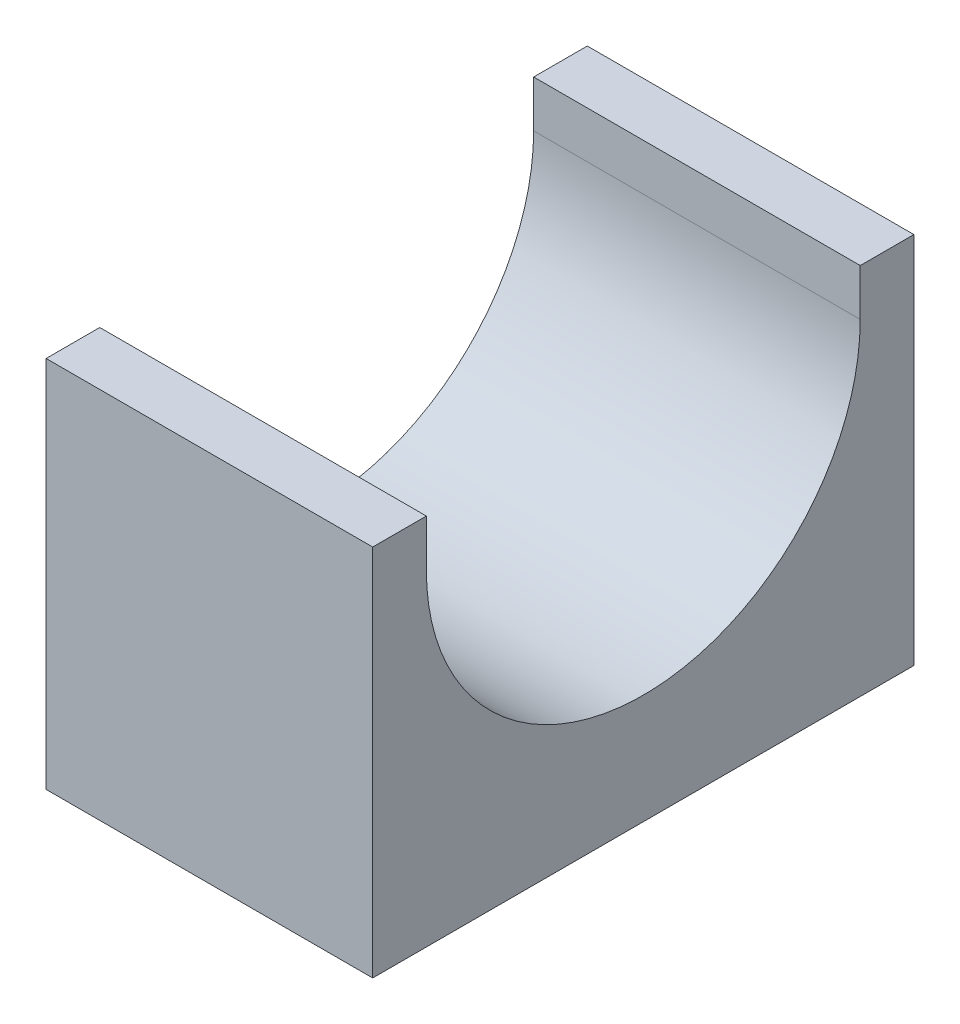
ISO-10303-21;
HEADER;
FILE_DESCRIPTION(('STEP AP214'),'2;1');
FILE_NAME('part.step','',(''),(''),'','','');
FILE_SCHEMA(('AUTOMOTIVE_DESIGN { 1 0 10303 214 1 1 1 1 }'));
ENDSEC;
DATA;
#1=APPLICATION_CONTEXT('core data for automotive mechanical design processes');
#2=APPLICATION_PROTOCOL_DEFINITION('international standard','automotive_design',2000,#1);
#3=PRODUCT_CONTEXT('',#1,'mechanical');
#4=PRODUCT('Part','Part','',(#3));
#5=PRODUCT_RELATED_PRODUCT_CATEGORY('part','',(#4));
#6=PRODUCT_DEFINITION_FORMATION('','',#4);
#7=PRODUCT_DEFINITION_CONTEXT('part definition',#1,'design');
#8=PRODUCT_DEFINITION('design','',#6,#7);
#9=PRODUCT_DEFINITION_SHAPE('','',#8);
#10=(LENGTH_UNIT() NAMED_UNIT(*) SI_UNIT(.MILLI.,.METRE.));
#11=(NAMED_UNIT(*) PLANE_ANGLE_UNIT() SI_UNIT($,.RADIAN.));
#12=(NAMED_UNIT(*) SI_UNIT($,.STERADIAN.) SOLID_ANGLE_UNIT());
#13=UNCERTAINTY_MEASURE_WITH_UNIT(LENGTH_MEASURE(1.E-05),#10,'distance_accuracy_value','');
#14=(GEOMETRIC_REPRESENTATION_CONTEXT(3) GLOBAL_UNCERTAINTY_ASSIGNED_CONTEXT((#13)) GLOBAL_UNIT_ASSIGNED_CONTEXT((#10,
#11,#12)) REPRESENTATION_CONTEXT('',''));
#15=CARTESIAN_POINT('',(0.,0.,0.));
#16=DIRECTION('',(0.,0.,1.));
#17=DIRECTION('',(1.,0.,0.));
#18=AXIS2_PLACEMENT_3D('',#15,#16,#17);
#19=CARTESIAN_POINT('',(0.,40.,0.));
#20=DIRECTION('',(0.,-1.,0.));
#21=DIRECTION('',(0.,0.,-1.));
#22=AXIS2_PLACEMENT_3D('',#19,#20,#21);
#23=PLANE('',#22);
#24=DIRECTION('',(0.,0.,-1.));
#25=VECTOR('',#24,1.);
#26=CARTESIAN_POINT('',(17.5,40.,29.));
#27=LINE('',#26,#25);
#28=CARTESIAN_POINT('',(17.5,40.,29.));
#29=VERTEX_POINT('',#28);
#30=CARTESIAN_POINT('',(17.5,40.,23.25));
#31=VERTEX_POINT('',#30);
#32=EDGE_CURVE('E153',#29,#31,#27,.T.);
#33=ORIENTED_EDGE('',*,*,#32,.T.);
#34=DIRECTION('',(-1.,0.,0.));
#35=VECTOR('',#34,1.);
#36=CARTESIAN_POINT('',(0.,40.,23.25));
#37=LINE('',#36,#35);
#38=CARTESIAN_POINT('',(-17.5,40.,23.25));
#39=VERTEX_POINT('',#38);
#40=EDGE_CURVE('E11',#31,#39,#37,.T.);
#41=ORIENTED_EDGE('',*,*,#40,.T.);
#42=DIRECTION('',(0.,0.,1.));
#43=VECTOR('',#42,1.);
#44=CARTESIAN_POINT('',(-17.5,40.,29.));
#45=LINE('',#44,#43);
#46=CARTESIAN_POINT('',(-17.5,40.,29.));
#47=VERTEX_POINT('',#46);
#48=EDGE_CURVE('E159',#39,#47,#45,.T.);
#49=ORIENTED_EDGE('',*,*,#48,.T.);
#50=DIRECTION('',(1.,0.,0.));
#51=VECTOR('',#50,1.);
#52=CARTESIAN_POINT('',(-17.5,40.,29.));
#53=LINE('',#52,#51);
#54=EDGE_CURVE('E64',#47,#29,#53,.T.);
#55=ORIENTED_EDGE('',*,*,#54,.T.);
#56=EDGE_LOOP('',(#33,#41,#49,#55));
#57=FACE_BOUND('',#56,.T.);
#58=ADVANCED_FACE('F39',(#57),#23,.F.);
#59=CARTESIAN_POINT('',(17.5,40.,29.));
#60=DIRECTION('',(-1.,0.,0.));
#61=DIRECTION('',(0.,0.,1.));
#62=AXIS2_PLACEMENT_3D('',#59,#60,#61);
#63=PLANE('',#62);
#64=CARTESIAN_POINT('',(17.5,35.,0.));
#65=DIRECTION('',(1.,0.,0.));
#66=DIRECTION('',(0.,0.,-1.));
#67=AXIS2_PLACEMENT_3D('',#64,#65,#66);
#68=CIRCLE('',#67,23.25);
#69=CARTESIAN_POINT('',(17.5,35.,23.25));
#70=VERTEX_POINT('',#69);
#71=CARTESIAN_POINT('',(17.5,35.,-23.25));
#72=VERTEX_POINT('',#71);
#73=EDGE_CURVE('E123',#70,#72,#68,.T.);
#74=ORIENTED_EDGE('',*,*,#73,.F.);
#75=DIRECTION('',(0.,-1.,0.));
#76=VECTOR('',#75,1.);
#77=CARTESIAN_POINT('',(17.5,35.,23.25));
#78=LINE('',#77,#76);
#79=EDGE_CURVE('E139',#31,#70,#78,.T.);
#80=ORIENTED_EDGE('',*,*,#79,.F.);
#81=ORIENTED_EDGE('',*,*,#32,.F.);
#82=DIRECTION('',(0.,-1.,0.));
#83=VECTOR('',#82,1.);
#84=CARTESIAN_POINT('',(17.5,40.,29.));
#85=LINE('',#84,#83);
#86=CARTESIAN_POINT('',(17.5,0.,29.));
#87=VERTEX_POINT('',#86);
#88=EDGE_CURVE('E165',#29,#87,#85,.T.);
#89=ORIENTED_EDGE('',*,*,#88,.T.);
#90=DIRECTION('',(0.,0.,-1.));
#91=VECTOR('',#90,1.);
#92=CARTESIAN_POINT('',(17.5,0.,29.));
#93=LINE('',#92,#91);
#94=CARTESIAN_POINT('',(17.5,0.,-29.));
#95=VERTEX_POINT('',#94);
#96=EDGE_CURVE('E151',#87,#95,#93,.T.);
#97=ORIENTED_EDGE('',*,*,#96,.T.);
#98=DIRECTION('',(0.,-1.,0.));
#99=VECTOR('',#98,1.);
#100=CARTESIAN_POINT('',(17.5,40.,-29.));
#101=LINE('',#100,#99);
#102=CARTESIAN_POINT('',(17.5,40.,-29.));
#103=VERTEX_POINT('',#102);
#104=EDGE_CURVE('E186',#103,#95,#101,.T.);
#105=ORIENTED_EDGE('',*,*,#104,.F.);
#106=CARTESIAN_POINT('',(17.5,40.,-23.25));
#107=VERTEX_POINT('',#106);
#108=EDGE_CURVE('E92',#107,#103,#27,.T.);
#109=ORIENTED_EDGE('',*,*,#108,.F.);
#110=DIRECTION('',(0.,1.,0.));
#111=VECTOR('',#110,1.);
#112=CARTESIAN_POINT('',(17.5,35.,-23.25));
#113=LINE('',#112,#111);
#114=EDGE_CURVE('E55',#72,#107,#113,.T.);
#115=ORIENTED_EDGE('',*,*,#114,.F.);
#116=EDGE_LOOP('',(#74,#80,#81,#89,#97,#105,#109,#115));
#117=FACE_BOUND('',#116,.T.);
#118=ADVANCED_FACE('F41',(#117),#63,.F.);
#119=CARTESIAN_POINT('',(-17.5,40.,-29.));
#120=DIRECTION('',(0.,0.,1.));
#121=DIRECTION('',(1.,0.,0.));
#122=AXIS2_PLACEMENT_3D('',#119,#120,#121);
#123=PLANE('',#122);
#124=DIRECTION('',(-1.,0.,0.));
#125=VECTOR('',#124,1.);
#126=CARTESIAN_POINT('',(-17.5,0.,-29.));
#127=LINE('',#126,#125);
#128=CARTESIAN_POINT('',(-17.5,0.,-29.));
#129=VERTEX_POINT('',#128);
#130=EDGE_CURVE('E169',#95,#129,#127,.T.);
#131=ORIENTED_EDGE('',*,*,#130,.T.);
#132=DIRECTION('',(0.,-1.,0.));
#133=VECTOR('',#132,1.);
#134=CARTESIAN_POINT('',(-17.5,40.,-29.));
#135=LINE('',#134,#133);
#136=CARTESIAN_POINT('',(-17.5,40.,-29.));
#137=VERTEX_POINT('',#136);
#138=EDGE_CURVE('E182',#137,#129,#135,.T.);
#139=ORIENTED_EDGE('',*,*,#138,.F.);
#140=DIRECTION('',(-1.,0.,0.));
#141=VECTOR('',#140,1.);
#142=CARTESIAN_POINT('',(-17.5,40.,-29.));
#143=LINE('',#142,#141);
#144=EDGE_CURVE('E156',#103,#137,#143,.T.);
#145=ORIENTED_EDGE('',*,*,#144,.F.);
#146=ORIENTED_EDGE('',*,*,#104,.T.);
#147=EDGE_LOOP('',(#131,#139,#145,#146));
#148=FACE_BOUND('',#147,.T.);
#149=ADVANCED_FACE('F218',(#148),#123,.F.);
#150=CARTESIAN_POINT('',(-17.5,40.,29.));
#151=DIRECTION('',(1.,0.,0.));
#152=DIRECTION('',(0.,0.,-1.));
#153=AXIS2_PLACEMENT_3D('',#150,#151,#152);
#154=PLANE('',#153);
#155=ORIENTED_EDGE('',*,*,#48,.F.);
#156=DIRECTION('',(0.,-1.,0.));
#157=VECTOR('',#156,1.);
#158=CARTESIAN_POINT('',(-17.5,35.,23.25));
#159=LINE('',#158,#157);
#160=CARTESIAN_POINT('',(-17.5,35.,23.25));
#161=VERTEX_POINT('',#160);
#162=EDGE_CURVE('E126',#39,#161,#159,.T.);
#163=ORIENTED_EDGE('',*,*,#162,.T.);
#164=CARTESIAN_POINT('',(-17.5,35.,0.));
#165=DIRECTION('',(1.,0.,0.));
#166=DIRECTION('',(0.,0.,-1.));
#167=AXIS2_PLACEMENT_3D('',#164,#165,#166);
#168=CIRCLE('',#167,23.25);
#169=CARTESIAN_POINT('',(-17.5,35.,-23.25));
#170=VERTEX_POINT('',#169);
#171=EDGE_CURVE('E120',#161,#170,#168,.T.);
#172=ORIENTED_EDGE('',*,*,#171,.T.);
#173=DIRECTION('',(0.,1.,0.));
#174=VECTOR('',#173,1.);
#175=CARTESIAN_POINT('',(-17.5,35.,-23.25));
#176=LINE('',#175,#174);
#177=CARTESIAN_POINT('',(-17.5,40.,-23.25));
#178=VERTEX_POINT('',#177);
#179=EDGE_CURVE('E129',#170,#178,#176,.T.);
#180=ORIENTED_EDGE('',*,*,#179,.T.);
#181=EDGE_CURVE('E160',#137,#178,#45,.T.);
#182=ORIENTED_EDGE('',*,*,#181,.F.);
#183=ORIENTED_EDGE('',*,*,#138,.T.);
#184=DIRECTION('',(0.,0.,1.));
#185=VECTOR('',#184,1.);
#186=CARTESIAN_POINT('',(-17.5,0.,29.));
#187=LINE('',#186,#185);
#188=CARTESIAN_POINT('',(-17.5,0.,29.));
#189=VERTEX_POINT('',#188);
#190=EDGE_CURVE('E172',#129,#189,#187,.T.);
#191=ORIENTED_EDGE('',*,*,#190,.T.);
#192=DIRECTION('',(0.,-1.,0.));
#193=VECTOR('',#192,1.);
#194=CARTESIAN_POINT('',(-17.5,40.,29.));
#195=LINE('',#194,#193);
#196=EDGE_CURVE('E179',#47,#189,#195,.T.);
#197=ORIENTED_EDGE('',*,*,#196,.F.);
#198=EDGE_LOOP('',(#155,#163,#172,#180,#182,#183,#191,#197));
#199=FACE_BOUND('',#198,.T.);
#200=ADVANCED_FACE('F137',(#199),#154,.F.);
#201=CARTESIAN_POINT('',(-17.5,40.,29.));
#202=DIRECTION('',(0.,0.,-1.));
#203=DIRECTION('',(-1.,0.,0.));
#204=AXIS2_PLACEMENT_3D('',#201,#202,#203);
#205=PLANE('',#204);
#206=DIRECTION('',(1.,0.,0.));
#207=VECTOR('',#206,1.);
#208=CARTESIAN_POINT('',(-17.5,0.,29.));
#209=LINE('',#208,#207);
#210=EDGE_CURVE('E85',#189,#87,#209,.T.);
#211=ORIENTED_EDGE('',*,*,#210,.T.);
#212=ORIENTED_EDGE('',*,*,#88,.F.);
#213=ORIENTED_EDGE('',*,*,#54,.F.);
#214=ORIENTED_EDGE('',*,*,#196,.T.);
#215=EDGE_LOOP('',(#211,#212,#213,#214));
#216=FACE_BOUND('',#215,.T.);
#217=ADVANCED_FACE('F197',(#216),#205,.F.);
#218=ORIENTED_EDGE('',*,*,#181,.T.);
#219=DIRECTION('',(1.,0.,0.));
#220=VECTOR('',#219,1.);
#221=CARTESIAN_POINT('',(0.,40.,-23.25));
#222=LINE('',#221,#220);
#223=EDGE_CURVE('E48',#178,#107,#222,.T.);
#224=ORIENTED_EDGE('',*,*,#223,.T.);
#225=ORIENTED_EDGE('',*,*,#108,.T.);
#226=ORIENTED_EDGE('',*,*,#144,.T.);
#227=EDGE_LOOP('',(#218,#224,#225,#226));
#228=FACE_BOUND('',#227,.T.);
#229=ADVANCED_FACE('F190',(#228),#23,.F.);
#230=CARTESIAN_POINT('',(0.,0.,0.));
#231=DIRECTION('',(0.,-1.,0.));
#232=DIRECTION('',(0.,0.,-1.));
#233=AXIS2_PLACEMENT_3D('',#230,#231,#232);
#234=PLANE('',#233);
#235=ORIENTED_EDGE('',*,*,#96,.F.);
#236=ORIENTED_EDGE('',*,*,#210,.F.);
#237=ORIENTED_EDGE('',*,*,#190,.F.);
#238=ORIENTED_EDGE('',*,*,#130,.F.);
#239=EDGE_LOOP('',(#235,#236,#237,#238));
#240=FACE_BOUND('',#239,.T.);
#241=ADVANCED_FACE('F204',(#240),#234,.T.);
#242=CARTESIAN_POINT('',(-17.5,35.,23.25));
#243=DIRECTION('',(0.,0.,1.));
#244=DIRECTION('',(1.,0.,0.));
#245=AXIS2_PLACEMENT_3D('',#242,#243,#244);
#246=PLANE('',#245);
#247=ORIENTED_EDGE('',*,*,#79,.T.);
#248=DIRECTION('',(1.,0.,0.));
#249=VECTOR('',#248,1.);
#250=CARTESIAN_POINT('',(-17.5,35.,23.25));
#251=LINE('',#250,#249);
#252=EDGE_CURVE('E125',#161,#70,#251,.T.);
#253=ORIENTED_EDGE('',*,*,#252,.F.);
#254=ORIENTED_EDGE('',*,*,#162,.F.);
#255=ORIENTED_EDGE('',*,*,#40,.F.);
#256=EDGE_LOOP('',(#247,#253,#254,#255));
#257=FACE_BOUND('',#256,.T.);
#258=ADVANCED_FACE('F202',(#257),#246,.F.);
#259=CARTESIAN_POINT('',(-17.5,35.,-23.25));
#260=DIRECTION('',(0.,0.,-1.));
#261=DIRECTION('',(-1.,0.,0.));
#262=AXIS2_PLACEMENT_3D('',#259,#260,#261);
#263=PLANE('',#262);
#264=ORIENTED_EDGE('',*,*,#179,.F.);
#265=DIRECTION('',(1.,0.,0.));
#266=VECTOR('',#265,1.);
#267=CARTESIAN_POINT('',(-17.5,35.,-23.25));
#268=LINE('',#267,#266);
#269=EDGE_CURVE('E115',#170,#72,#268,.T.);
#270=ORIENTED_EDGE('',*,*,#269,.T.);
#271=ORIENTED_EDGE('',*,*,#114,.T.);
#272=ORIENTED_EDGE('',*,*,#223,.F.);
#273=EDGE_LOOP('',(#264,#270,#271,#272));
#274=FACE_BOUND('',#273,.T.);
#275=ADVANCED_FACE('F130',(#274),#263,.F.);
#276=CARTESIAN_POINT('',(-17.5,35.,0.));
#277=DIRECTION('',(1.,0.,0.));
#278=DIRECTION('',(0.,0.,-1.));
#279=AXIS2_PLACEMENT_3D('',#276,#277,#278);
#280=CYLINDRICAL_SURFACE('',#279,23.25);
#281=ORIENTED_EDGE('',*,*,#73,.T.);
#282=ORIENTED_EDGE('',*,*,#269,.F.);
#283=ORIENTED_EDGE('',*,*,#171,.F.);
#284=ORIENTED_EDGE('',*,*,#252,.T.);
#285=EDGE_LOOP('',(#281,#282,#283,#284));
#286=FACE_BOUND('',#285,.T.);
#287=ADVANCED_FACE('F117',(#286),#280,.F.);
#288=CLOSED_SHELL('',(#58,#118,#149,#200,#217,#229,#241,#258,#275,#287));
#289=MANIFOLD_SOLID_BREP('B2',#288);
#290=ADVANCED_BREP_SHAPE_REPRESENTATION('',(#18,#289),#14);
#291=SHAPE_DEFINITION_REPRESENTATION(#9,#290);
ENDSEC;
END-ISO-10303-21;
